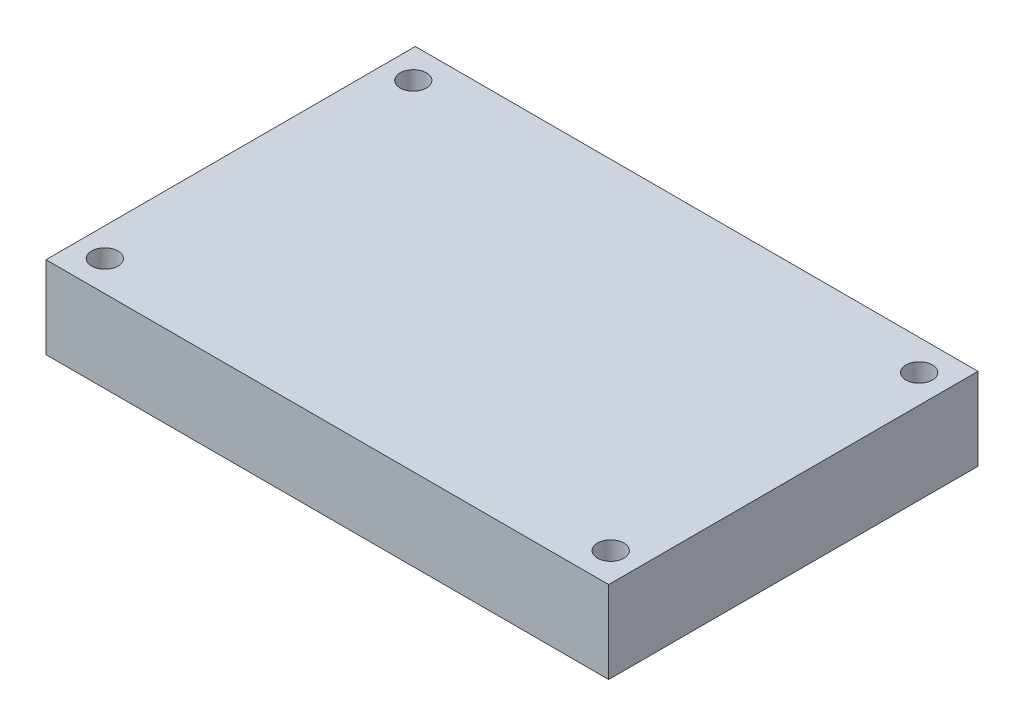
ISO-10303-21;
HEADER;
FILE_DESCRIPTION(('STEP AP214'),'2;1');
FILE_NAME('part.step','',(''),(''),'','','');
FILE_SCHEMA(('AUTOMOTIVE_DESIGN { 1 0 10303 214 1 1 1 1 }'));
ENDSEC;
DATA;
#1=APPLICATION_CONTEXT('core data for automotive mechanical design processes');
#2=APPLICATION_PROTOCOL_DEFINITION('international standard','automotive_design',2000,#1);
#3=PRODUCT_CONTEXT('',#1,'mechanical');
#4=PRODUCT('Part','Part','',(#3));
#5=PRODUCT_RELATED_PRODUCT_CATEGORY('part','',(#4));
#6=PRODUCT_DEFINITION_FORMATION('','',#4);
#7=PRODUCT_DEFINITION_CONTEXT('part definition',#1,'design');
#8=PRODUCT_DEFINITION('design','',#6,#7);
#9=PRODUCT_DEFINITION_SHAPE('','',#8);
#10=(LENGTH_UNIT() NAMED_UNIT(*) SI_UNIT(.MILLI.,.METRE.));
#11=(NAMED_UNIT(*) PLANE_ANGLE_UNIT() SI_UNIT($,.RADIAN.));
#12=(NAMED_UNIT(*) SI_UNIT($,.STERADIAN.) SOLID_ANGLE_UNIT());
#13=UNCERTAINTY_MEASURE_WITH_UNIT(LENGTH_MEASURE(1.E-05),#10,'distance_accuracy_value','');
#14=(GEOMETRIC_REPRESENTATION_CONTEXT(3) GLOBAL_UNCERTAINTY_ASSIGNED_CONTEXT((#13)) GLOBAL_UNIT_ASSIGNED_CONTEXT((#10,
#11,#12)) REPRESENTATION_CONTEXT('',''));
#15=CARTESIAN_POINT('',(0.,0.,0.));
#16=DIRECTION('',(0.,0.,1.));
#17=DIRECTION('',(1.,0.,0.));
#18=AXIS2_PLACEMENT_3D('',#15,#16,#17);
#19=CARTESIAN_POINT('',(34.2,10.,-22.45));
#20=DIRECTION('',(-1.,0.,0.));
#21=DIRECTION('',(0.,0.,1.));
#22=AXIS2_PLACEMENT_3D('',#19,#20,#21);
#23=PLANE('',#22);
#24=DIRECTION('',(0.,0.,-1.));
#25=VECTOR('',#24,1.);
#26=CARTESIAN_POINT('',(34.2,0.,-22.45));
#27=LINE('',#26,#25);
#28=CARTESIAN_POINT('',(34.2,0.,22.45));
#29=VERTEX_POINT('',#28);
#30=CARTESIAN_POINT('',(34.2,0.,-22.45));
#31=VERTEX_POINT('',#30);
#32=EDGE_CURVE('E98',#29,#31,#27,.T.);
#33=ORIENTED_EDGE('',*,*,#32,.T.);
#34=DIRECTION('',(0.,-1.,0.));
#35=VECTOR('',#34,1.);
#36=CARTESIAN_POINT('',(34.2,10.,-22.45));
#37=LINE('',#36,#35);
#38=CARTESIAN_POINT('',(34.2,10.,-22.45));
#39=VERTEX_POINT('',#38);
#40=EDGE_CURVE('E11',#39,#31,#37,.T.);
#41=ORIENTED_EDGE('',*,*,#40,.F.);
#42=DIRECTION('',(0.,0.,-1.));
#43=VECTOR('',#42,1.);
#44=CARTESIAN_POINT('',(34.2,10.,-22.45));
#45=LINE('',#44,#43);
#46=CARTESIAN_POINT('',(34.2,10.,22.45));
#47=VERTEX_POINT('',#46);
#48=EDGE_CURVE('E86',#47,#39,#45,.T.);
#49=ORIENTED_EDGE('',*,*,#48,.F.);
#50=DIRECTION('',(0.,-1.,0.));
#51=VECTOR('',#50,1.);
#52=CARTESIAN_POINT('',(34.2,10.,22.45));
#53=LINE('',#52,#51);
#54=EDGE_CURVE('E94',#47,#29,#53,.T.);
#55=ORIENTED_EDGE('',*,*,#54,.T.);
#56=EDGE_LOOP('',(#33,#41,#49,#55));
#57=FACE_BOUND('',#56,.T.);
#58=ADVANCED_FACE('F35',(#57),#23,.F.);
#59=CARTESIAN_POINT('',(-34.2,10.,-22.45));
#60=DIRECTION('',(0.,0.,1.));
#61=DIRECTION('',(1.,0.,0.));
#62=AXIS2_PLACEMENT_3D('',#59,#60,#61);
#63=PLANE('',#62);
#64=DIRECTION('',(-1.,0.,0.));
#65=VECTOR('',#64,1.);
#66=CARTESIAN_POINT('',(-34.2,0.,-22.45));
#67=LINE('',#66,#65);
#68=CARTESIAN_POINT('',(-34.2,0.,-22.45));
#69=VERTEX_POINT('',#68);
#70=EDGE_CURVE('E90',#31,#69,#67,.T.);
#71=ORIENTED_EDGE('',*,*,#70,.T.);
#72=DIRECTION('',(0.,-1.,0.));
#73=VECTOR('',#72,1.);
#74=CARTESIAN_POINT('',(-34.2,10.,-22.45));
#75=LINE('',#74,#73);
#76=CARTESIAN_POINT('',(-34.2,10.,-22.45));
#77=VERTEX_POINT('',#76);
#78=EDGE_CURVE('E43',#77,#69,#75,.T.);
#79=ORIENTED_EDGE('',*,*,#78,.F.);
#80=DIRECTION('',(-1.,0.,0.));
#81=VECTOR('',#80,1.);
#82=CARTESIAN_POINT('',(-34.2,10.,-22.45));
#83=LINE('',#82,#81);
#84=EDGE_CURVE('E81',#39,#77,#83,.T.);
#85=ORIENTED_EDGE('',*,*,#84,.F.);
#86=ORIENTED_EDGE('',*,*,#40,.T.);
#87=EDGE_LOOP('',(#71,#79,#85,#86));
#88=FACE_BOUND('',#87,.T.);
#89=ADVANCED_FACE('F89',(#88),#63,.F.);
#90=CARTESIAN_POINT('',(-34.2,10.,-22.45));
#91=DIRECTION('',(1.,0.,0.));
#92=DIRECTION('',(0.,0.,-1.));
#93=AXIS2_PLACEMENT_3D('',#90,#91,#92);
#94=PLANE('',#93);
#95=DIRECTION('',(0.,0.,1.));
#96=VECTOR('',#95,1.);
#97=CARTESIAN_POINT('',(-34.2,0.,-22.45));
#98=LINE('',#97,#96);
#99=CARTESIAN_POINT('',(-34.2,0.,22.45));
#100=VERTEX_POINT('',#99);
#101=EDGE_CURVE('E68',#69,#100,#98,.T.);
#102=ORIENTED_EDGE('',*,*,#101,.T.);
#103=DIRECTION('',(0.,-1.,0.));
#104=VECTOR('',#103,1.);
#105=CARTESIAN_POINT('',(-34.2,10.,22.45));
#106=LINE('',#105,#104);
#107=CARTESIAN_POINT('',(-34.2,10.,22.45));
#108=VERTEX_POINT('',#107);
#109=EDGE_CURVE('E91',#108,#100,#106,.T.);
#110=ORIENTED_EDGE('',*,*,#109,.F.);
#111=DIRECTION('',(0.,0.,1.));
#112=VECTOR('',#111,1.);
#113=CARTESIAN_POINT('',(-34.2,10.,-22.45));
#114=LINE('',#113,#112);
#115=EDGE_CURVE('E84',#77,#108,#114,.T.);
#116=ORIENTED_EDGE('',*,*,#115,.F.);
#117=ORIENTED_EDGE('',*,*,#78,.T.);
#118=EDGE_LOOP('',(#102,#110,#116,#117));
#119=FACE_BOUND('',#118,.T.);
#120=ADVANCED_FACE('F92',(#119),#94,.F.);
#121=CARTESIAN_POINT('',(-34.2,10.,22.45));
#122=DIRECTION('',(0.,0.,-1.));
#123=DIRECTION('',(-1.,0.,0.));
#124=AXIS2_PLACEMENT_3D('',#121,#122,#123);
#125=PLANE('',#124);
#126=DIRECTION('',(1.,0.,0.));
#127=VECTOR('',#126,1.);
#128=CARTESIAN_POINT('',(-34.2,0.,22.45));
#129=LINE('',#128,#127);
#130=EDGE_CURVE('E74',#100,#29,#129,.T.);
#131=ORIENTED_EDGE('',*,*,#130,.T.);
#132=ORIENTED_EDGE('',*,*,#54,.F.);
#133=DIRECTION('',(1.,0.,0.));
#134=VECTOR('',#133,1.);
#135=CARTESIAN_POINT('',(-34.2,10.,22.45));
#136=LINE('',#135,#134);
#137=EDGE_CURVE('E51',#108,#47,#136,.T.);
#138=ORIENTED_EDGE('',*,*,#137,.F.);
#139=ORIENTED_EDGE('',*,*,#109,.T.);
#140=EDGE_LOOP('',(#131,#132,#138,#139));
#141=FACE_BOUND('',#140,.T.);
#142=ADVANCED_FACE('F106',(#141),#125,.F.);
#143=CARTESIAN_POINT('',(0.,10.,0.));
#144=DIRECTION('',(0.,1.,0.));
#145=DIRECTION('',(0.,0.,1.));
#146=AXIS2_PLACEMENT_3D('',#143,#144,#145);
#147=PLANE('',#146);
#148=CARTESIAN_POINT('',(-30.75,10.,-18.75));
#149=DIRECTION('',(0.,1.,0.));
#150=DIRECTION('',(0.,0.,1.));
#151=AXIS2_PLACEMENT_3D('',#148,#149,#150);
#152=CIRCLE('',#151,1.6);
#153=CARTESIAN_POINT('',(-30.75,10.,-17.15));
#154=VERTEX_POINT('',#153);
#155=EDGE_CURVE('E118',#154,#154,#152,.T.);
#156=ORIENTED_EDGE('',*,*,#155,.F.);
#157=EDGE_LOOP('',(#156));
#158=FACE_BOUND('',#157,.T.);
#159=CARTESIAN_POINT('',(-30.75,10.,18.75));
#160=DIRECTION('',(0.,1.,0.));
#161=DIRECTION('',(0.,0.,1.));
#162=AXIS2_PLACEMENT_3D('',#159,#160,#161);
#163=CIRCLE('',#162,1.6);
#164=CARTESIAN_POINT('',(-30.75,10.,20.35));
#165=VERTEX_POINT('',#164);
#166=EDGE_CURVE('E125',#165,#165,#163,.T.);
#167=ORIENTED_EDGE('',*,*,#166,.F.);
#168=EDGE_LOOP('',(#167));
#169=FACE_BOUND('',#168,.T.);
#170=CARTESIAN_POINT('',(30.75,10.,18.75));
#171=DIRECTION('',(0.,1.,0.));
#172=DIRECTION('',(0.,0.,1.));
#173=AXIS2_PLACEMENT_3D('',#170,#171,#172);
#174=CIRCLE('',#173,1.6);
#175=CARTESIAN_POINT('',(30.75,10.,20.35));
#176=VERTEX_POINT('',#175);
#177=EDGE_CURVE('E117',#176,#176,#174,.T.);
#178=ORIENTED_EDGE('',*,*,#177,.F.);
#179=EDGE_LOOP('',(#178));
#180=FACE_BOUND('',#179,.T.);
#181=CARTESIAN_POINT('',(30.75,10.,-18.75));
#182=DIRECTION('',(0.,1.,0.));
#183=DIRECTION('',(0.,0.,1.));
#184=AXIS2_PLACEMENT_3D('',#181,#182,#183);
#185=CIRCLE('',#184,1.6);
#186=CARTESIAN_POINT('',(30.75,10.,-17.15));
#187=VERTEX_POINT('',#186);
#188=EDGE_CURVE('E101',#187,#187,#185,.T.);
#189=ORIENTED_EDGE('',*,*,#188,.F.);
#190=EDGE_LOOP('',(#189));
#191=FACE_BOUND('',#190,.T.);
#192=ORIENTED_EDGE('',*,*,#48,.T.);
#193=ORIENTED_EDGE('',*,*,#84,.T.);
#194=ORIENTED_EDGE('',*,*,#115,.T.);
#195=ORIENTED_EDGE('',*,*,#137,.T.);
#196=EDGE_LOOP('',(#192,#193,#194,#195));
#197=FACE_BOUND('',#196,.T.);
#198=ADVANCED_FACE('F82',(#158,#169,#180,#191,#197),#147,.T.);
#199=CARTESIAN_POINT('',(0.,0.,0.));
#200=DIRECTION('',(0.,1.,0.));
#201=DIRECTION('',(0.,0.,1.));
#202=AXIS2_PLACEMENT_3D('',#199,#200,#201);
#203=PLANE('',#202);
#204=CARTESIAN_POINT('',(-30.75,0.,-18.75));
#205=DIRECTION('',(0.,1.,0.));
#206=DIRECTION('',(0.,0.,1.));
#207=AXIS2_PLACEMENT_3D('',#204,#205,#206);
#208=CIRCLE('',#207,1.6);
#209=CARTESIAN_POINT('',(-30.75,0.,-17.15));
#210=VERTEX_POINT('',#209);
#211=EDGE_CURVE('E122',#210,#210,#208,.T.);
#212=ORIENTED_EDGE('',*,*,#211,.T.);
#213=EDGE_LOOP('',(#212));
#214=FACE_BOUND('',#213,.T.);
#215=CARTESIAN_POINT('',(-30.75,0.,18.75));
#216=DIRECTION('',(0.,1.,0.));
#217=DIRECTION('',(0.,0.,1.));
#218=AXIS2_PLACEMENT_3D('',#215,#216,#217);
#219=CIRCLE('',#218,1.6);
#220=CARTESIAN_POINT('',(-30.75,0.,20.35));
#221=VERTEX_POINT('',#220);
#222=EDGE_CURVE('E121',#221,#221,#219,.T.);
#223=ORIENTED_EDGE('',*,*,#222,.T.);
#224=EDGE_LOOP('',(#223));
#225=FACE_BOUND('',#224,.T.);
#226=CARTESIAN_POINT('',(30.75,0.,18.75));
#227=DIRECTION('',(0.,1.,0.));
#228=DIRECTION('',(0.,0.,1.));
#229=AXIS2_PLACEMENT_3D('',#226,#227,#228);
#230=CIRCLE('',#229,1.6);
#231=CARTESIAN_POINT('',(30.75,0.,20.35));
#232=VERTEX_POINT('',#231);
#233=EDGE_CURVE('E128',#232,#232,#230,.T.);
#234=ORIENTED_EDGE('',*,*,#233,.T.);
#235=EDGE_LOOP('',(#234));
#236=FACE_BOUND('',#235,.T.);
#237=CARTESIAN_POINT('',(30.75,0.,-18.75));
#238=DIRECTION('',(0.,1.,0.));
#239=DIRECTION('',(0.,0.,1.));
#240=AXIS2_PLACEMENT_3D('',#237,#238,#239);
#241=CIRCLE('',#240,1.6);
#242=CARTESIAN_POINT('',(30.75,0.,-17.15));
#243=VERTEX_POINT('',#242);
#244=EDGE_CURVE('E114',#243,#243,#241,.T.);
#245=ORIENTED_EDGE('',*,*,#244,.T.);
#246=EDGE_LOOP('',(#245));
#247=FACE_BOUND('',#246,.T.);
#248=ORIENTED_EDGE('',*,*,#32,.F.);
#249=ORIENTED_EDGE('',*,*,#130,.F.);
#250=ORIENTED_EDGE('',*,*,#101,.F.);
#251=ORIENTED_EDGE('',*,*,#70,.F.);
#252=EDGE_LOOP('',(#248,#249,#250,#251));
#253=FACE_BOUND('',#252,.T.);
#254=ADVANCED_FACE('F109',(#214,#225,#236,#247,#253),#203,.F.);
#255=CARTESIAN_POINT('',(30.75,10.001,-18.75));
#256=DIRECTION('',(0.,-1.,0.));
#257=DIRECTION('',(0.,0.,-1.));
#258=AXIS2_PLACEMENT_3D('',#255,#256,#257);
#259=CYLINDRICAL_SURFACE('',#258,1.6);
#260=ORIENTED_EDGE('',*,*,#188,.T.);
#261=EDGE_LOOP('',(#260));
#262=FACE_BOUND('',#261,.T.);
#263=ORIENTED_EDGE('',*,*,#244,.F.);
#264=EDGE_LOOP('',(#263));
#265=FACE_BOUND('',#264,.T.);
#266=ADVANCED_FACE('F141',(#262,#265),#259,.F.);
#267=CARTESIAN_POINT('',(30.75,10.001,18.75));
#268=DIRECTION('',(0.,-1.,0.));
#269=DIRECTION('',(0.,0.,-1.));
#270=AXIS2_PLACEMENT_3D('',#267,#268,#269);
#271=CYLINDRICAL_SURFACE('',#270,1.6);
#272=ORIENTED_EDGE('',*,*,#177,.T.);
#273=EDGE_LOOP('',(#272));
#274=FACE_BOUND('',#273,.T.);
#275=ORIENTED_EDGE('',*,*,#233,.F.);
#276=EDGE_LOOP('',(#275));
#277=FACE_BOUND('',#276,.T.);
#278=ADVANCED_FACE('F138',(#274,#277),#271,.F.);
#279=CARTESIAN_POINT('',(-30.75,10.001,18.75));
#280=DIRECTION('',(0.,-1.,0.));
#281=DIRECTION('',(0.,0.,-1.));
#282=AXIS2_PLACEMENT_3D('',#279,#280,#281);
#283=CYLINDRICAL_SURFACE('',#282,1.6);
#284=ORIENTED_EDGE('',*,*,#166,.T.);
#285=EDGE_LOOP('',(#284));
#286=FACE_BOUND('',#285,.T.);
#287=ORIENTED_EDGE('',*,*,#222,.F.);
#288=EDGE_LOOP('',(#287));
#289=FACE_BOUND('',#288,.T.);
#290=ADVANCED_FACE('F140',(#286,#289),#283,.F.);
#291=CARTESIAN_POINT('',(-30.75,10.001,-18.75));
#292=DIRECTION('',(0.,-1.,0.));
#293=DIRECTION('',(0.,0.,-1.));
#294=AXIS2_PLACEMENT_3D('',#291,#292,#293);
#295=CYLINDRICAL_SURFACE('',#294,1.6);
#296=ORIENTED_EDGE('',*,*,#155,.T.);
#297=EDGE_LOOP('',(#296));
#298=FACE_BOUND('',#297,.T.);
#299=ORIENTED_EDGE('',*,*,#211,.F.);
#300=EDGE_LOOP('',(#299));
#301=FACE_BOUND('',#300,.T.);
#302=ADVANCED_FACE('F148',(#298,#301),#295,.F.);
#303=CLOSED_SHELL('',(#58,#89,#120,#142,#198,#254,#266,#278,#290,#302));
#304=MANIFOLD_SOLID_BREP('B2',#303);
#305=ADVANCED_BREP_SHAPE_REPRESENTATION('',(#18,#304),#14);
#306=SHAPE_DEFINITION_REPRESENTATION(#9,#305);
ENDSEC;
END-ISO-10303-21;
